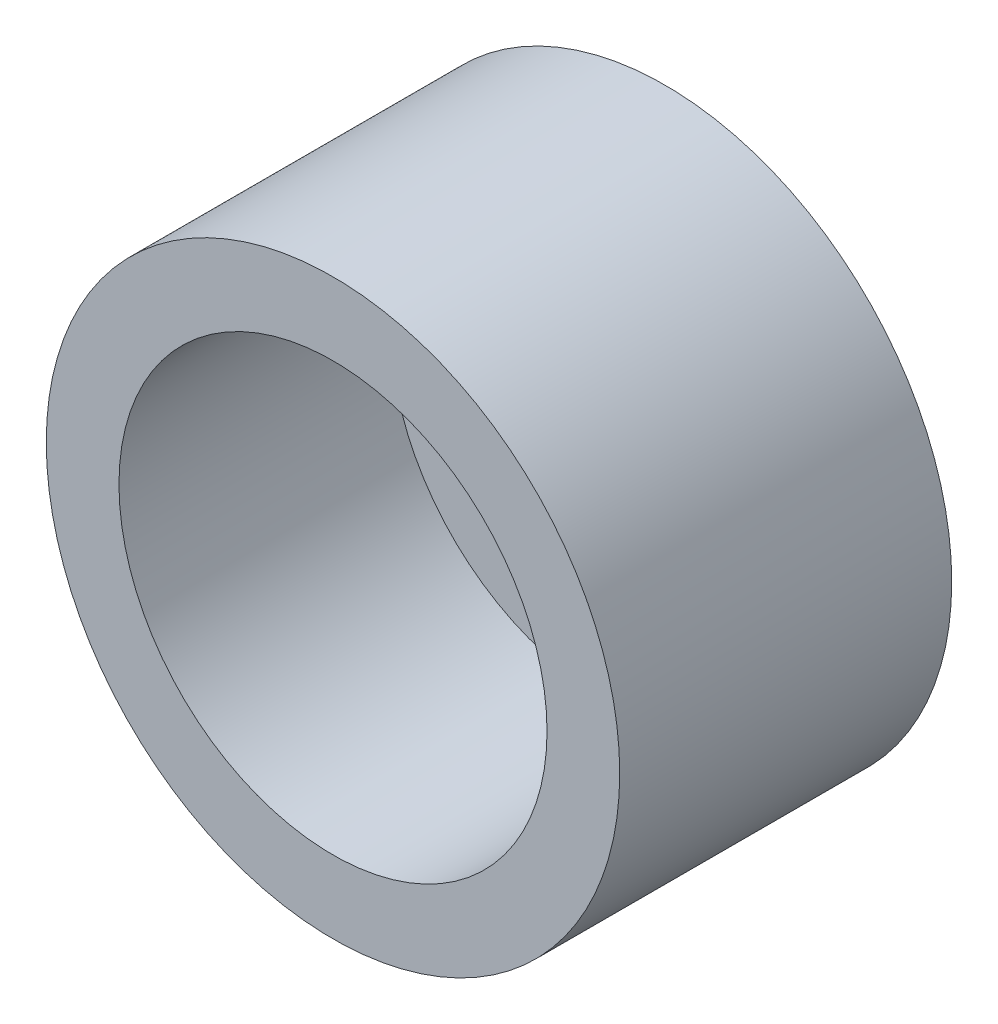
ISO-10303-21;
HEADER;
FILE_DESCRIPTION(('STEP AP214'),'2;1');
FILE_NAME('part.step','',(''),(''),'','','');
FILE_SCHEMA(('AUTOMOTIVE_DESIGN { 1 0 10303 214 1 1 1 1 }'));
ENDSEC;
DATA;
#1=APPLICATION_CONTEXT('core data for automotive mechanical design processes');
#2=APPLICATION_PROTOCOL_DEFINITION('international standard','automotive_design',2000,#1);
#3=PRODUCT_CONTEXT('',#1,'mechanical');
#4=PRODUCT('Part','Part','',(#3));
#5=PRODUCT_RELATED_PRODUCT_CATEGORY('part','',(#4));
#6=PRODUCT_DEFINITION_FORMATION('','',#4);
#7=PRODUCT_DEFINITION_CONTEXT('part definition',#1,'design');
#8=PRODUCT_DEFINITION('design','',#6,#7);
#9=PRODUCT_DEFINITION_SHAPE('','',#8);
#10=(LENGTH_UNIT() NAMED_UNIT(*) SI_UNIT(.MILLI.,.METRE.));
#11=(NAMED_UNIT(*) PLANE_ANGLE_UNIT() SI_UNIT($,.RADIAN.));
#12=(NAMED_UNIT(*) SI_UNIT($,.STERADIAN.) SOLID_ANGLE_UNIT());
#13=UNCERTAINTY_MEASURE_WITH_UNIT(LENGTH_MEASURE(1.E-05),#10,'distance_accuracy_value','');
#14=(GEOMETRIC_REPRESENTATION_CONTEXT(3) GLOBAL_UNCERTAINTY_ASSIGNED_CONTEXT((#13)) GLOBAL_UNIT_ASSIGNED_CONTEXT((#10,
#11,#12)) REPRESENTATION_CONTEXT('',''));
#15=CARTESIAN_POINT('',(0.,0.,0.));
#16=DIRECTION('',(0.,0.,1.));
#17=DIRECTION('',(1.,0.,0.));
#18=AXIS2_PLACEMENT_3D('',#15,#16,#17);
#19=CARTESIAN_POINT('',(0.,0.,-11.));
#20=DIRECTION('',(0.,0.,1.));
#21=DIRECTION('',(1.00000000000001,0.,0.));
#22=AXIS2_PLACEMENT_3D('',#19,#20,#21);
#23=CYLINDRICAL_SURFACE('',#22,9.5);
#24=CARTESIAN_POINT('',(0.,0.,-11.));
#25=DIRECTION('',(0.,0.,1.));
#26=DIRECTION('',(1.00000000000001,0.,0.));
#27=AXIS2_PLACEMENT_3D('',#24,#25,#26);
#28=CIRCLE('',#27,9.5);
#29=CARTESIAN_POINT('',(9.50000000000006,4.71435390725361E-13,-11.));
#30=VERTEX_POINT('',#29);
#31=EDGE_CURVE('E10',#30,#30,#28,.T.);
#32=ORIENTED_EDGE('',*,*,#31,.T.);
#33=EDGE_LOOP('',(#32));
#34=FACE_BOUND('',#33,.T.);
#35=CARTESIAN_POINT('',(0.,0.,0.));
#36=DIRECTION('',(0.,0.,1.));
#37=DIRECTION('',(1.00000000000001,0.,0.));
#38=AXIS2_PLACEMENT_3D('',#35,#36,#37);
#39=CIRCLE('',#38,9.5);
#40=CARTESIAN_POINT('',(9.50000000000008,4.8271109331921E-13,0.));
#41=VERTEX_POINT('',#40);
#42=EDGE_CURVE('E37',#41,#41,#39,.T.);
#43=ORIENTED_EDGE('',*,*,#42,.F.);
#44=EDGE_LOOP('',(#43));
#45=FACE_BOUND('',#44,.T.);
#46=ADVANCED_FACE('F31',(#34,#45),#23,.T.);
#47=CARTESIAN_POINT('',(0.,0.,-11.));
#48=DIRECTION('',(0.,0.,1.));
#49=DIRECTION('',(1.00000000000001,0.,0.));
#50=AXIS2_PLACEMENT_3D('',#47,#48,#49);
#51=PLANE('',#50);
#52=ORIENTED_EDGE('',*,*,#31,.F.);
#53=EDGE_LOOP('',(#52));
#54=FACE_BOUND('',#53,.T.);
#55=ADVANCED_FACE('F55',(#54),#51,.F.);
#56=CARTESIAN_POINT('',(0.,0.,0.));
#57=DIRECTION('',(0.,0.,1.));
#58=DIRECTION('',(1.00000000000001,0.,0.));
#59=AXIS2_PLACEMENT_3D('',#56,#57,#58);
#60=PLANE('',#59);
#61=CARTESIAN_POINT('',(0.,0.,0.));
#62=DIRECTION('',(0.,0.,1.));
#63=DIRECTION('',(1.,0.,0.));
#64=AXIS2_PLACEMENT_3D('',#61,#62,#63);
#65=CIRCLE('',#64,7.09150000000004);
#66=CARTESIAN_POINT('',(7.09150000000009,1.88721954730299E-13,0.));
#67=VERTEX_POINT('',#66);
#68=EDGE_CURVE('E45',#67,#67,#65,.T.);
#69=ORIENTED_EDGE('',*,*,#68,.F.);
#70=EDGE_LOOP('',(#69));
#71=FACE_BOUND('',#70,.T.);
#72=ORIENTED_EDGE('',*,*,#42,.T.);
#73=EDGE_LOOP('',(#72));
#74=FACE_BOUND('',#73,.T.);
#75=ADVANCED_FACE('F53',(#71,#74),#60,.T.);
#76=CARTESIAN_POINT('',(0.,0.,-9.00000000000001));
#77=DIRECTION('',(0.,0.,1.));
#78=DIRECTION('',(1.,0.,0.));
#79=AXIS2_PLACEMENT_3D('',#76,#77,#78);
#80=CYLINDRICAL_SURFACE('',#79,7.09150000000004);
#81=CARTESIAN_POINT('',(0.,0.,-9.00000000000001));
#82=DIRECTION('',(0.,0.,1.));
#83=DIRECTION('',(1.,0.,0.));
#84=AXIS2_PLACEMENT_3D('',#81,#82,#83);
#85=CIRCLE('',#84,7.09150000000004);
#86=CARTESIAN_POINT('',(7.09150000000004,1.93058763420241E-13,-9.00000000000002));
#87=VERTEX_POINT('',#86);
#88=EDGE_CURVE('E41',#87,#87,#85,.T.);
#89=ORIENTED_EDGE('',*,*,#88,.F.);
#90=EDGE_LOOP('',(#89));
#91=FACE_BOUND('',#90,.T.);
#92=ORIENTED_EDGE('',*,*,#68,.T.);
#93=EDGE_LOOP('',(#92));
#94=FACE_BOUND('',#93,.T.);
#95=ADVANCED_FACE('F51',(#91,#94),#80,.F.);
#96=CARTESIAN_POINT('',(0.,0.,-9.00000000000001));
#97=DIRECTION('',(0.,0.,1.));
#98=DIRECTION('',(1.,0.,0.));
#99=AXIS2_PLACEMENT_3D('',#96,#97,#98);
#100=PLANE('',#99);
#101=ORIENTED_EDGE('',*,*,#88,.T.);
#102=EDGE_LOOP('',(#101));
#103=FACE_BOUND('',#102,.T.);
#104=ADVANCED_FACE('F61',(#103),#100,.T.);
#105=CLOSED_SHELL('',(#46,#55,#75,#95,#104));
#106=MANIFOLD_SOLID_BREP('B2',#105);
#107=ADVANCED_BREP_SHAPE_REPRESENTATION('',(#18,#106),#14);
#108=SHAPE_DEFINITION_REPRESENTATION(#9,#107);
ENDSEC;
END-ISO-10303-21;
